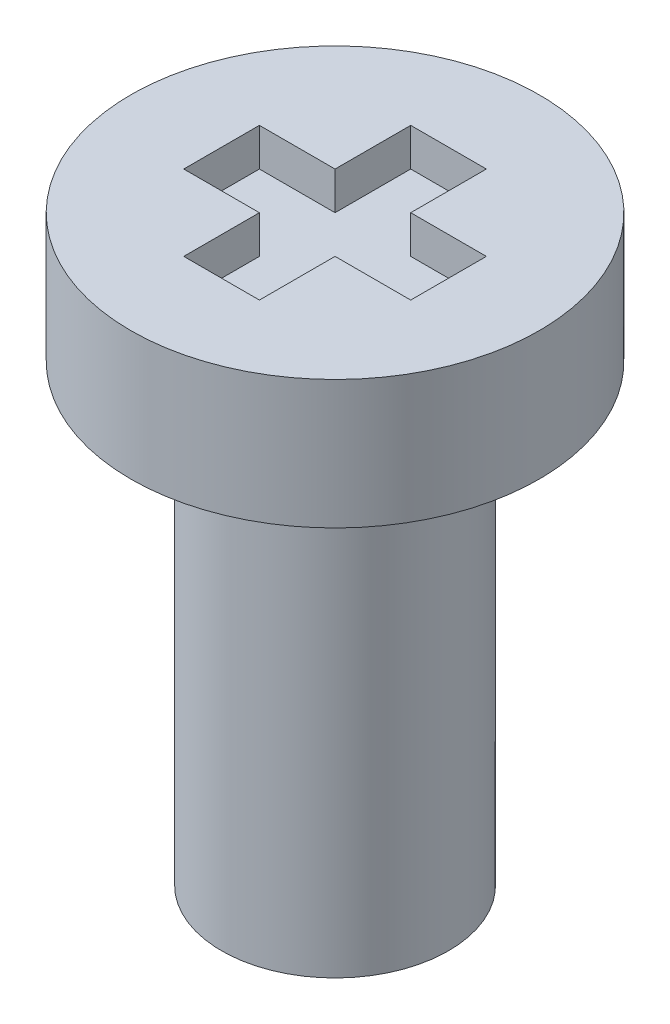
ISO-10303-21;
HEADER;
FILE_DESCRIPTION(('STEP AP214'),'2;1');
FILE_NAME('part.step','',(''),(''),'','','');
FILE_SCHEMA(('AUTOMOTIVE_DESIGN { 1 0 10303 214 1 1 1 1 }'));
ENDSEC;
DATA;
#1=APPLICATION_CONTEXT('core data for automotive mechanical design processes');
#2=APPLICATION_PROTOCOL_DEFINITION('international standard','automotive_design',2000,#1);
#3=PRODUCT_CONTEXT('',#1,'mechanical');
#4=PRODUCT('Part','Part','',(#3));
#5=PRODUCT_RELATED_PRODUCT_CATEGORY('part','',(#4));
#6=PRODUCT_DEFINITION_FORMATION('','',#4);
#7=PRODUCT_DEFINITION_CONTEXT('part definition',#1,'design');
#8=PRODUCT_DEFINITION('design','',#6,#7);
#9=PRODUCT_DEFINITION_SHAPE('','',#8);
#10=(LENGTH_UNIT() NAMED_UNIT(*) SI_UNIT(.MILLI.,.METRE.));
#11=(NAMED_UNIT(*) PLANE_ANGLE_UNIT() SI_UNIT($,.RADIAN.));
#12=(NAMED_UNIT(*) SI_UNIT($,.STERADIAN.) SOLID_ANGLE_UNIT());
#13=UNCERTAINTY_MEASURE_WITH_UNIT(LENGTH_MEASURE(1.E-05),#10,'distance_accuracy_value','');
#14=(GEOMETRIC_REPRESENTATION_CONTEXT(3) GLOBAL_UNCERTAINTY_ASSIGNED_CONTEXT((#13)) GLOBAL_UNIT_ASSIGNED_CONTEXT((#10,
#11,#12)) REPRESENTATION_CONTEXT('',''));
#15=CARTESIAN_POINT('',(0.,0.,0.));
#16=DIRECTION('',(0.,0.,1.));
#17=DIRECTION('',(1.,0.,0.));
#18=AXIS2_PLACEMENT_3D('',#15,#16,#17);
#19=CARTESIAN_POINT('',(0.,1.7,0.));
#20=DIRECTION('',(0.,-1.,0.));
#21=DIRECTION('',(0.,0.,-1.));
#22=AXIS2_PLACEMENT_3D('',#19,#20,#21);
#23=CYLINDRICAL_SURFACE('',#22,2.7);
#24=CARTESIAN_POINT('',(0.,1.7,0.));
#25=DIRECTION('',(0.,1.,0.));
#26=DIRECTION('',(0.,0.,1.));
#27=AXIS2_PLACEMENT_3D('',#24,#25,#26);
#28=CIRCLE('',#27,2.7);
#29=CARTESIAN_POINT('',(0.,1.7,2.7));
#30=VERTEX_POINT('',#29);
#31=EDGE_CURVE('E53',#30,#30,#28,.T.);
#32=ORIENTED_EDGE('',*,*,#31,.F.);
#33=EDGE_LOOP('',(#32));
#34=FACE_BOUND('',#33,.T.);
#35=CARTESIAN_POINT('',(0.,0.,0.));
#36=DIRECTION('',(0.,1.,0.));
#37=DIRECTION('',(0.,0.,1.));
#38=AXIS2_PLACEMENT_3D('',#35,#36,#37);
#39=CIRCLE('',#38,2.7);
#40=CARTESIAN_POINT('',(0.,0.,2.7));
#41=VERTEX_POINT('',#40);
#42=EDGE_CURVE('E48',#41,#41,#39,.T.);
#43=ORIENTED_EDGE('',*,*,#42,.T.);
#44=EDGE_LOOP('',(#43));
#45=FACE_BOUND('',#44,.T.);
#46=ADVANCED_FACE('F45',(#34,#45),#23,.T.);
#47=CARTESIAN_POINT('',(0.,1.7,0.));
#48=DIRECTION('',(0.,1.,0.));
#49=DIRECTION('',(0.,0.,1.));
#50=AXIS2_PLACEMENT_3D('',#47,#48,#49);
#51=PLANE('',#50);
#52=DIRECTION('',(-1.,0.,0.));
#53=VECTOR('',#52,1.);
#54=CARTESIAN_POINT('',(0.,1.7,-1.5));
#55=LINE('',#54,#53);
#56=CARTESIAN_POINT('',(0.5,1.7,-1.5));
#57=VERTEX_POINT('',#56);
#58=CARTESIAN_POINT('',(-0.5,1.7,-1.5));
#59=VERTEX_POINT('',#58);
#60=EDGE_CURVE('E197',#57,#59,#55,.T.);
#61=ORIENTED_EDGE('',*,*,#60,.F.);
#62=DIRECTION('',(0.,0.,-1.));
#63=VECTOR('',#62,1.);
#64=CARTESIAN_POINT('',(0.5,1.7,-1.5));
#65=LINE('',#64,#63);
#66=CARTESIAN_POINT('',(0.5,1.7,-0.5));
#67=VERTEX_POINT('',#66);
#68=EDGE_CURVE('E195',#67,#57,#65,.T.);
#69=ORIENTED_EDGE('',*,*,#68,.F.);
#70=DIRECTION('',(-1.,0.,0.));
#71=VECTOR('',#70,1.);
#72=CARTESIAN_POINT('',(0.5,1.7,-0.5));
#73=LINE('',#72,#71);
#74=CARTESIAN_POINT('',(1.5,1.7,-0.5));
#75=VERTEX_POINT('',#74);
#76=EDGE_CURVE('E193',#75,#67,#73,.T.);
#77=ORIENTED_EDGE('',*,*,#76,.F.);
#78=DIRECTION('',(0.,0.,-1.));
#79=VECTOR('',#78,1.);
#80=CARTESIAN_POINT('',(1.5,1.7,0.));
#81=LINE('',#80,#79);
#82=CARTESIAN_POINT('',(1.5,1.7,0.5));
#83=VERTEX_POINT('',#82);
#84=EDGE_CURVE('E154',#83,#75,#81,.T.);
#85=ORIENTED_EDGE('',*,*,#84,.F.);
#86=DIRECTION('',(1.,0.,0.));
#87=VECTOR('',#86,1.);
#88=CARTESIAN_POINT('',(1.5,1.7,0.5));
#89=LINE('',#88,#87);
#90=CARTESIAN_POINT('',(0.5,1.7,0.5));
#91=VERTEX_POINT('',#90);
#92=EDGE_CURVE('E189',#91,#83,#89,.T.);
#93=ORIENTED_EDGE('',*,*,#92,.F.);
#94=DIRECTION('',(0.,0.,-1.));
#95=VECTOR('',#94,1.);
#96=CARTESIAN_POINT('',(0.5,1.7,0.5));
#97=LINE('',#96,#95);
#98=CARTESIAN_POINT('',(0.5,1.7,1.5));
#99=VERTEX_POINT('',#98);
#100=EDGE_CURVE('E186',#99,#91,#97,.T.);
#101=ORIENTED_EDGE('',*,*,#100,.F.);
#102=DIRECTION('',(1.,0.,0.));
#103=VECTOR('',#102,1.);
#104=CARTESIAN_POINT('',(0.5,1.7,1.5));
#105=LINE('',#104,#103);
#106=CARTESIAN_POINT('',(-0.5,1.7,1.5));
#107=VERTEX_POINT('',#106);
#108=EDGE_CURVE('E183',#107,#99,#105,.T.);
#109=ORIENTED_EDGE('',*,*,#108,.F.);
#110=DIRECTION('',(0.,0.,1.));
#111=VECTOR('',#110,1.);
#112=CARTESIAN_POINT('',(-0.5,1.7,1.5));
#113=LINE('',#112,#111);
#114=CARTESIAN_POINT('',(-0.5,1.7,0.5));
#115=VERTEX_POINT('',#114);
#116=EDGE_CURVE('E180',#115,#107,#113,.T.);
#117=ORIENTED_EDGE('',*,*,#116,.F.);
#118=DIRECTION('',(1.,0.,0.));
#119=VECTOR('',#118,1.);
#120=CARTESIAN_POINT('',(-0.5,1.7,0.5));
#121=LINE('',#120,#119);
#122=CARTESIAN_POINT('',(-1.5,1.7,0.5));
#123=VERTEX_POINT('',#122);
#124=EDGE_CURVE('E177',#123,#115,#121,.T.);
#125=ORIENTED_EDGE('',*,*,#124,.F.);
#126=DIRECTION('',(0.,0.,1.));
#127=VECTOR('',#126,1.);
#128=CARTESIAN_POINT('',(-1.5,1.7,0.));
#129=LINE('',#128,#127);
#130=CARTESIAN_POINT('',(-1.5,1.7,-0.5));
#131=VERTEX_POINT('',#130);
#132=EDGE_CURVE('E174',#131,#123,#129,.T.);
#133=ORIENTED_EDGE('',*,*,#132,.F.);
#134=DIRECTION('',(-1.,0.,0.));
#135=VECTOR('',#134,1.);
#136=CARTESIAN_POINT('',(-1.5,1.7,-0.5));
#137=LINE('',#136,#135);
#138=CARTESIAN_POINT('',(-0.5,1.7,-0.5));
#139=VERTEX_POINT('',#138);
#140=EDGE_CURVE('E170',#139,#131,#137,.T.);
#141=ORIENTED_EDGE('',*,*,#140,.F.);
#142=DIRECTION('',(0.,0.,1.));
#143=VECTOR('',#142,1.);
#144=CARTESIAN_POINT('',(-0.5,1.7,-0.5));
#145=LINE('',#144,#143);
#146=EDGE_CURVE('E168',#59,#139,#145,.T.);
#147=ORIENTED_EDGE('',*,*,#146,.F.);
#148=EDGE_LOOP('',(#61,#69,#77,#85,#93,#101,#109,#117,#125,#133,#141,#147));
#149=FACE_BOUND('',#148,.T.);
#150=ORIENTED_EDGE('',*,*,#31,.T.);
#151=EDGE_LOOP('',(#150));
#152=FACE_BOUND('',#151,.T.);
#153=ADVANCED_FACE('F226',(#149,#152),#51,.T.);
#154=CARTESIAN_POINT('',(0.,0.,0.));
#155=DIRECTION('',(0.,1.,0.));
#156=DIRECTION('',(0.,0.,1.));
#157=AXIS2_PLACEMENT_3D('',#154,#155,#156);
#158=PLANE('',#157);
#159=CARTESIAN_POINT('',(0.,0.,0.));
#160=DIRECTION('',(0.,-1.,0.));
#161=DIRECTION('',(0.,0.,-1.));
#162=AXIS2_PLACEMENT_3D('',#159,#160,#161);
#163=CIRCLE('',#162,1.5);
#164=CARTESIAN_POINT('',(0.,0.,-1.5));
#165=VERTEX_POINT('',#164);
#166=EDGE_CURVE('E11',#165,#165,#163,.T.);
#167=ORIENTED_EDGE('',*,*,#166,.F.);
#168=EDGE_LOOP('',(#167));
#169=FACE_BOUND('',#168,.T.);
#170=ORIENTED_EDGE('',*,*,#42,.F.);
#171=EDGE_LOOP('',(#170));
#172=FACE_BOUND('',#171,.T.);
#173=ADVANCED_FACE('F223',(#169,#172),#158,.F.);
#174=CARTESIAN_POINT('',(0.,1.2,-1.5));
#175=DIRECTION('',(0.,0.,-1.));
#176=DIRECTION('',(-1.,0.,0.));
#177=AXIS2_PLACEMENT_3D('',#174,#175,#176);
#178=PLANE('',#177);
#179=ORIENTED_EDGE('',*,*,#60,.T.);
#180=DIRECTION('',(0.,1.,0.));
#181=VECTOR('',#180,1.);
#182=CARTESIAN_POINT('',(-0.5,1.2,-1.5));
#183=LINE('',#182,#181);
#184=CARTESIAN_POINT('',(-0.5,1.2,-1.5));
#185=VERTEX_POINT('',#184);
#186=EDGE_CURVE('E61',#185,#59,#183,.T.);
#187=ORIENTED_EDGE('',*,*,#186,.F.);
#188=DIRECTION('',(-1.,0.,0.));
#189=VECTOR('',#188,1.);
#190=CARTESIAN_POINT('',(0.,1.2,-1.5));
#191=LINE('',#190,#189);
#192=CARTESIAN_POINT('',(0.5,1.2,-1.5));
#193=VERTEX_POINT('',#192);
#194=EDGE_CURVE('E69',#193,#185,#191,.T.);
#195=ORIENTED_EDGE('',*,*,#194,.F.);
#196=DIRECTION('',(0.,1.,0.));
#197=VECTOR('',#196,1.);
#198=CARTESIAN_POINT('',(0.5,1.2,-1.5));
#199=LINE('',#198,#197);
#200=EDGE_CURVE('E107',#193,#57,#199,.T.);
#201=ORIENTED_EDGE('',*,*,#200,.T.);
#202=EDGE_LOOP('',(#179,#187,#195,#201));
#203=FACE_BOUND('',#202,.T.);
#204=ADVANCED_FACE('F225',(#203),#178,.F.);
#205=CARTESIAN_POINT('',(0.5,1.2,-1.5));
#206=DIRECTION('',(1.,0.,0.));
#207=DIRECTION('',(0.,0.,-1.));
#208=AXIS2_PLACEMENT_3D('',#205,#206,#207);
#209=PLANE('',#208);
#210=ORIENTED_EDGE('',*,*,#68,.T.);
#211=ORIENTED_EDGE('',*,*,#200,.F.);
#212=DIRECTION('',(0.,0.,-1.));
#213=VECTOR('',#212,1.);
#214=CARTESIAN_POINT('',(0.5,1.2,-1.5));
#215=LINE('',#214,#213);
#216=CARTESIAN_POINT('',(0.5,1.2,-0.5));
#217=VERTEX_POINT('',#216);
#218=EDGE_CURVE('E163',#217,#193,#215,.T.);
#219=ORIENTED_EDGE('',*,*,#218,.F.);
#220=DIRECTION('',(0.,1.,0.));
#221=VECTOR('',#220,1.);
#222=CARTESIAN_POINT('',(0.5,1.2,-0.5));
#223=LINE('',#222,#221);
#224=EDGE_CURVE('E158',#217,#67,#223,.T.);
#225=ORIENTED_EDGE('',*,*,#224,.T.);
#226=EDGE_LOOP('',(#210,#211,#219,#225));
#227=FACE_BOUND('',#226,.T.);
#228=ADVANCED_FACE('F233',(#227),#209,.F.);
#229=CARTESIAN_POINT('',(0.5,1.2,-0.5));
#230=DIRECTION('',(0.,0.,-1.));
#231=DIRECTION('',(-1.,0.,0.));
#232=AXIS2_PLACEMENT_3D('',#229,#230,#231);
#233=PLANE('',#232);
#234=ORIENTED_EDGE('',*,*,#76,.T.);
#235=ORIENTED_EDGE('',*,*,#224,.F.);
#236=DIRECTION('',(-1.,0.,0.));
#237=VECTOR('',#236,1.);
#238=CARTESIAN_POINT('',(0.5,1.2,-0.5));
#239=LINE('',#238,#237);
#240=CARTESIAN_POINT('',(1.5,1.2,-0.5));
#241=VERTEX_POINT('',#240);
#242=EDGE_CURVE('E144',#241,#217,#239,.T.);
#243=ORIENTED_EDGE('',*,*,#242,.F.);
#244=DIRECTION('',(0.,1.,0.));
#245=VECTOR('',#244,1.);
#246=CARTESIAN_POINT('',(1.5,1.2,-0.5));
#247=LINE('',#246,#245);
#248=EDGE_CURVE('E151',#241,#75,#247,.T.);
#249=ORIENTED_EDGE('',*,*,#248,.T.);
#250=EDGE_LOOP('',(#234,#235,#243,#249));
#251=FACE_BOUND('',#250,.T.);
#252=ADVANCED_FACE('F161',(#251),#233,.F.);
#253=CARTESIAN_POINT('',(1.5,1.2,0.));
#254=DIRECTION('',(1.,0.,0.));
#255=DIRECTION('',(0.,0.,-1.));
#256=AXIS2_PLACEMENT_3D('',#253,#254,#255);
#257=PLANE('',#256);
#258=ORIENTED_EDGE('',*,*,#84,.T.);
#259=ORIENTED_EDGE('',*,*,#248,.F.);
#260=DIRECTION('',(0.,0.,-1.));
#261=VECTOR('',#260,1.);
#262=CARTESIAN_POINT('',(1.5,1.2,0.5));
#263=LINE('',#262,#261);
#264=CARTESIAN_POINT('',(1.5,1.2,0.5));
#265=VERTEX_POINT('',#264);
#266=EDGE_CURVE('E139',#265,#241,#263,.T.);
#267=ORIENTED_EDGE('',*,*,#266,.F.);
#268=DIRECTION('',(0.,1.,0.));
#269=VECTOR('',#268,1.);
#270=CARTESIAN_POINT('',(1.5,1.2,0.5));
#271=LINE('',#270,#269);
#272=EDGE_CURVE('E159',#265,#83,#271,.T.);
#273=ORIENTED_EDGE('',*,*,#272,.T.);
#274=EDGE_LOOP('',(#258,#259,#267,#273));
#275=FACE_BOUND('',#274,.T.);
#276=ADVANCED_FACE('F152',(#275),#257,.F.);
#277=CARTESIAN_POINT('',(1.5,1.2,0.5));
#278=DIRECTION('',(0.,0.,1.));
#279=DIRECTION('',(1.,0.,0.));
#280=AXIS2_PLACEMENT_3D('',#277,#278,#279);
#281=PLANE('',#280);
#282=ORIENTED_EDGE('',*,*,#92,.T.);
#283=ORIENTED_EDGE('',*,*,#272,.F.);
#284=DIRECTION('',(1.,0.,0.));
#285=VECTOR('',#284,1.);
#286=CARTESIAN_POINT('',(1.5,1.2,0.5));
#287=LINE('',#286,#285);
#288=CARTESIAN_POINT('',(0.5,1.2,0.5));
#289=VERTEX_POINT('',#288);
#290=EDGE_CURVE('E147',#289,#265,#287,.T.);
#291=ORIENTED_EDGE('',*,*,#290,.F.);
#292=DIRECTION('',(0.,1.,0.));
#293=VECTOR('',#292,1.);
#294=CARTESIAN_POINT('',(0.5,1.2,0.5));
#295=LINE('',#294,#293);
#296=EDGE_CURVE('E202',#289,#91,#295,.T.);
#297=ORIENTED_EDGE('',*,*,#296,.T.);
#298=EDGE_LOOP('',(#282,#283,#291,#297));
#299=FACE_BOUND('',#298,.T.);
#300=ADVANCED_FACE('F276',(#299),#281,.F.);
#301=CARTESIAN_POINT('',(0.5,1.2,0.5));
#302=DIRECTION('',(1.,0.,0.));
#303=DIRECTION('',(0.,0.,-1.));
#304=AXIS2_PLACEMENT_3D('',#301,#302,#303);
#305=PLANE('',#304);
#306=ORIENTED_EDGE('',*,*,#100,.T.);
#307=ORIENTED_EDGE('',*,*,#296,.F.);
#308=DIRECTION('',(0.,0.,-1.));
#309=VECTOR('',#308,1.);
#310=CARTESIAN_POINT('',(0.5,1.2,0.5));
#311=LINE('',#310,#309);
#312=CARTESIAN_POINT('',(0.5,1.2,1.5));
#313=VERTEX_POINT('',#312);
#314=EDGE_CURVE('E396',#313,#289,#311,.T.);
#315=ORIENTED_EDGE('',*,*,#314,.F.);
#316=DIRECTION('',(0.,1.,0.));
#317=VECTOR('',#316,1.);
#318=CARTESIAN_POINT('',(0.5,1.2,1.5));
#319=LINE('',#318,#317);
#320=EDGE_CURVE('E204',#313,#99,#319,.T.);
#321=ORIENTED_EDGE('',*,*,#320,.T.);
#322=EDGE_LOOP('',(#306,#307,#315,#321));
#323=FACE_BOUND('',#322,.T.);
#324=ADVANCED_FACE('F283',(#323),#305,.F.);
#325=CARTESIAN_POINT('',(0.5,1.2,1.5));
#326=DIRECTION('',(0.,0.,1.));
#327=DIRECTION('',(1.,0.,0.));
#328=AXIS2_PLACEMENT_3D('',#325,#326,#327);
#329=PLANE('',#328);
#330=ORIENTED_EDGE('',*,*,#108,.T.);
#331=ORIENTED_EDGE('',*,*,#320,.F.);
#332=DIRECTION('',(1.,0.,0.));
#333=VECTOR('',#332,1.);
#334=CARTESIAN_POINT('',(0.,1.2,1.5));
#335=LINE('',#334,#333);
#336=CARTESIAN_POINT('',(-0.5,1.2,1.5));
#337=VERTEX_POINT('',#336);
#338=EDGE_CURVE('E394',#337,#313,#335,.T.);
#339=ORIENTED_EDGE('',*,*,#338,.F.);
#340=DIRECTION('',(0.,1.,0.));
#341=VECTOR('',#340,1.);
#342=CARTESIAN_POINT('',(-0.5,1.2,1.5));
#343=LINE('',#342,#341);
#344=EDGE_CURVE('E206',#337,#107,#343,.T.);
#345=ORIENTED_EDGE('',*,*,#344,.T.);
#346=EDGE_LOOP('',(#330,#331,#339,#345));
#347=FACE_BOUND('',#346,.T.);
#348=ADVANCED_FACE('F292',(#347),#329,.F.);
#349=CARTESIAN_POINT('',(-0.5,1.2,1.5));
#350=DIRECTION('',(-1.,0.,0.));
#351=DIRECTION('',(0.,0.,1.));
#352=AXIS2_PLACEMENT_3D('',#349,#350,#351);
#353=PLANE('',#352);
#354=ORIENTED_EDGE('',*,*,#116,.T.);
#355=ORIENTED_EDGE('',*,*,#344,.F.);
#356=DIRECTION('',(0.,0.,1.));
#357=VECTOR('',#356,1.);
#358=CARTESIAN_POINT('',(-0.5,1.2,1.5));
#359=LINE('',#358,#357);
#360=CARTESIAN_POINT('',(-0.5,1.2,0.5));
#361=VERTEX_POINT('',#360);
#362=EDGE_CURVE('E391',#361,#337,#359,.T.);
#363=ORIENTED_EDGE('',*,*,#362,.F.);
#364=DIRECTION('',(0.,1.,0.));
#365=VECTOR('',#364,1.);
#366=CARTESIAN_POINT('',(-0.5,1.2,0.5));
#367=LINE('',#366,#365);
#368=EDGE_CURVE('E208',#361,#115,#367,.T.);
#369=ORIENTED_EDGE('',*,*,#368,.T.);
#370=EDGE_LOOP('',(#354,#355,#363,#369));
#371=FACE_BOUND('',#370,.T.);
#372=ADVANCED_FACE('F302',(#371),#353,.F.);
#373=CARTESIAN_POINT('',(-0.5,1.2,0.5));
#374=DIRECTION('',(0.,0.,1.));
#375=DIRECTION('',(1.,0.,0.));
#376=AXIS2_PLACEMENT_3D('',#373,#374,#375);
#377=PLANE('',#376);
#378=ORIENTED_EDGE('',*,*,#124,.T.);
#379=ORIENTED_EDGE('',*,*,#368,.F.);
#380=DIRECTION('',(1.,0.,0.));
#381=VECTOR('',#380,1.);
#382=CARTESIAN_POINT('',(-0.5,1.2,0.5));
#383=LINE('',#382,#381);
#384=CARTESIAN_POINT('',(-1.5,1.2,0.5));
#385=VERTEX_POINT('',#384);
#386=EDGE_CURVE('E388',#385,#361,#383,.T.);
#387=ORIENTED_EDGE('',*,*,#386,.F.);
#388=DIRECTION('',(0.,1.,0.));
#389=VECTOR('',#388,1.);
#390=CARTESIAN_POINT('',(-1.5,1.2,0.5));
#391=LINE('',#390,#389);
#392=EDGE_CURVE('E210',#385,#123,#391,.T.);
#393=ORIENTED_EDGE('',*,*,#392,.T.);
#394=EDGE_LOOP('',(#378,#379,#387,#393));
#395=FACE_BOUND('',#394,.T.);
#396=ADVANCED_FACE('F310',(#395),#377,.F.);
#397=CARTESIAN_POINT('',(-1.5,1.2,0.));
#398=DIRECTION('',(-1.,0.,0.));
#399=DIRECTION('',(0.,0.,1.));
#400=AXIS2_PLACEMENT_3D('',#397,#398,#399);
#401=PLANE('',#400);
#402=ORIENTED_EDGE('',*,*,#132,.T.);
#403=ORIENTED_EDGE('',*,*,#392,.F.);
#404=DIRECTION('',(0.,0.,1.));
#405=VECTOR('',#404,1.);
#406=CARTESIAN_POINT('',(-1.5,1.2,0.));
#407=LINE('',#406,#405);
#408=CARTESIAN_POINT('',(-1.5,1.2,-0.5));
#409=VERTEX_POINT('',#408);
#410=EDGE_CURVE('E386',#409,#385,#407,.T.);
#411=ORIENTED_EDGE('',*,*,#410,.F.);
#412=DIRECTION('',(0.,1.,0.));
#413=VECTOR('',#412,1.);
#414=CARTESIAN_POINT('',(-1.5,1.2,-0.5));
#415=LINE('',#414,#413);
#416=EDGE_CURVE('E212',#409,#131,#415,.T.);
#417=ORIENTED_EDGE('',*,*,#416,.T.);
#418=EDGE_LOOP('',(#402,#403,#411,#417));
#419=FACE_BOUND('',#418,.T.);
#420=ADVANCED_FACE('F319',(#419),#401,.F.);
#421=CARTESIAN_POINT('',(-1.5,1.2,-0.5));
#422=DIRECTION('',(0.,0.,-1.));
#423=DIRECTION('',(-1.,0.,0.));
#424=AXIS2_PLACEMENT_3D('',#421,#422,#423);
#425=PLANE('',#424);
#426=ORIENTED_EDGE('',*,*,#140,.T.);
#427=ORIENTED_EDGE('',*,*,#416,.F.);
#428=DIRECTION('',(-1.,0.,0.));
#429=VECTOR('',#428,1.);
#430=CARTESIAN_POINT('',(-1.5,1.2,-0.5));
#431=LINE('',#430,#429);
#432=CARTESIAN_POINT('',(-0.5,1.2,-0.5));
#433=VERTEX_POINT('',#432);
#434=EDGE_CURVE('E383',#433,#409,#431,.T.);
#435=ORIENTED_EDGE('',*,*,#434,.F.);
#436=DIRECTION('',(0.,1.,0.));
#437=VECTOR('',#436,1.);
#438=CARTESIAN_POINT('',(-0.5,1.2,-0.5));
#439=LINE('',#438,#437);
#440=EDGE_CURVE('E214',#433,#139,#439,.T.);
#441=ORIENTED_EDGE('',*,*,#440,.T.);
#442=EDGE_LOOP('',(#426,#427,#435,#441));
#443=FACE_BOUND('',#442,.T.);
#444=ADVANCED_FACE('F329',(#443),#425,.F.);
#445=CARTESIAN_POINT('',(-0.5,1.2,-0.5));
#446=DIRECTION('',(-1.,0.,0.));
#447=DIRECTION('',(0.,0.,1.));
#448=AXIS2_PLACEMENT_3D('',#445,#446,#447);
#449=PLANE('',#448);
#450=ORIENTED_EDGE('',*,*,#146,.T.);
#451=ORIENTED_EDGE('',*,*,#440,.F.);
#452=DIRECTION('',(0.,0.,1.));
#453=VECTOR('',#452,1.);
#454=CARTESIAN_POINT('',(-0.5,1.2,-0.5));
#455=LINE('',#454,#453);
#456=EDGE_CURVE('E380',#185,#433,#455,.T.);
#457=ORIENTED_EDGE('',*,*,#456,.F.);
#458=ORIENTED_EDGE('',*,*,#186,.T.);
#459=EDGE_LOOP('',(#450,#451,#457,#458));
#460=FACE_BOUND('',#459,.T.);
#461=ADVANCED_FACE('F337',(#460),#449,.F.);
#462=CARTESIAN_POINT('',(0.,1.2,0.));
#463=DIRECTION('',(0.,-1.,0.));
#464=DIRECTION('',(0.,0.,-1.));
#465=AXIS2_PLACEMENT_3D('',#462,#463,#464);
#466=PLANE('',#465);
#467=ORIENTED_EDGE('',*,*,#194,.T.);
#468=ORIENTED_EDGE('',*,*,#456,.T.);
#469=ORIENTED_EDGE('',*,*,#434,.T.);
#470=ORIENTED_EDGE('',*,*,#410,.T.);
#471=ORIENTED_EDGE('',*,*,#386,.T.);
#472=ORIENTED_EDGE('',*,*,#362,.T.);
#473=ORIENTED_EDGE('',*,*,#338,.T.);
#474=ORIENTED_EDGE('',*,*,#314,.T.);
#475=ORIENTED_EDGE('',*,*,#290,.T.);
#476=ORIENTED_EDGE('',*,*,#266,.T.);
#477=ORIENTED_EDGE('',*,*,#242,.T.);
#478=ORIENTED_EDGE('',*,*,#218,.T.);
#479=EDGE_LOOP('',(#467,#468,#469,#470,#471,#472,#473,#474,#475,#476,#477,#478));
#480=FACE_BOUND('',#479,.T.);
#481=ADVANCED_FACE('F141',(#480),#466,.F.);
#482=CARTESIAN_POINT('',(0.,-6.,0.));
#483=DIRECTION('',(0.,1.,0.));
#484=DIRECTION('',(0.,0.,1.));
#485=AXIS2_PLACEMENT_3D('',#482,#483,#484);
#486=CYLINDRICAL_SURFACE('',#485,1.5);
#487=CARTESIAN_POINT('',(0.,-6.,0.));
#488=DIRECTION('',(0.,-1.,0.));
#489=DIRECTION('',(0.,0.,-1.));
#490=AXIS2_PLACEMENT_3D('',#487,#488,#489);
#491=CIRCLE('',#490,1.5);
#492=CARTESIAN_POINT('',(0.,-6.,-1.5));
#493=VERTEX_POINT('',#492);
#494=EDGE_CURVE('E171',#493,#493,#491,.T.);
#495=ORIENTED_EDGE('',*,*,#494,.F.);
#496=EDGE_LOOP('',(#495));
#497=FACE_BOUND('',#496,.T.);
#498=ORIENTED_EDGE('',*,*,#166,.T.);
#499=EDGE_LOOP('',(#498));
#500=FACE_BOUND('',#499,.T.);
#501=ADVANCED_FACE('F351',(#497,#500),#486,.T.);
#502=CARTESIAN_POINT('',(0.,-6.,0.));
#503=DIRECTION('',(0.,-1.,0.));
#504=DIRECTION('',(0.,0.,-1.));
#505=AXIS2_PLACEMENT_3D('',#502,#503,#504);
#506=PLANE('',#505);
#507=ORIENTED_EDGE('',*,*,#494,.T.);
#508=EDGE_LOOP('',(#507));
#509=FACE_BOUND('',#508,.T.);
#510=ADVANCED_FACE('F362',(#509),#506,.T.);
#511=CLOSED_SHELL('',(#46,#153,#173,#204,#228,#252,#276,#300,#324,#348,#372,#396,#420,#444,#461,
#481,#501,#510));
#512=MANIFOLD_SOLID_BREP('B2',#511);
#513=ADVANCED_BREP_SHAPE_REPRESENTATION('',(#18,#512),#14);
#514=SHAPE_DEFINITION_REPRESENTATION(#9,#513);
ENDSEC;
END-ISO-10303-21;
